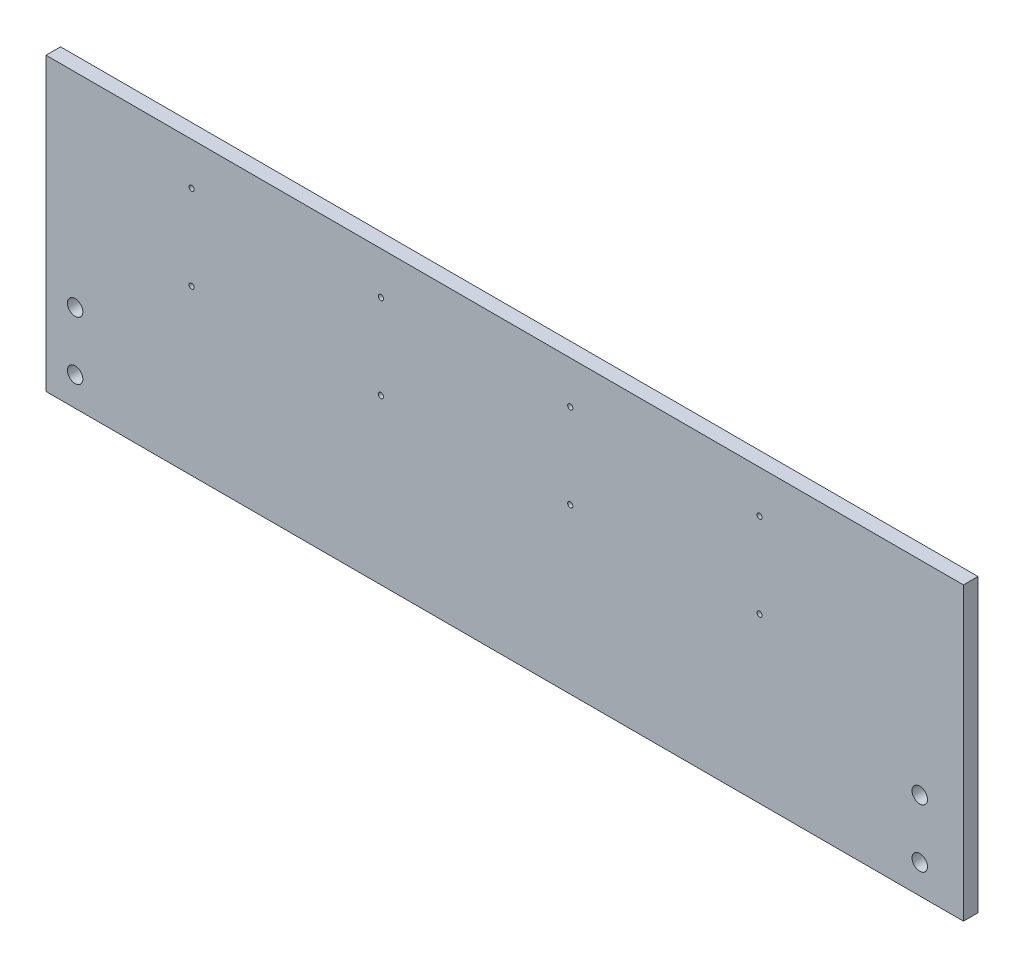
ISO-10303-21;
HEADER;
FILE_DESCRIPTION(('STEP AP214'),'2;1');
FILE_NAME('part.step','',(''),(''),'','','');
FILE_SCHEMA(('AUTOMOTIVE_DESIGN { 1 0 10303 214 1 1 1 1 }'));
ENDSEC;
DATA;
#1=APPLICATION_CONTEXT('core data for automotive mechanical design processes');
#2=APPLICATION_PROTOCOL_DEFINITION('international standard','automotive_design',2000,#1);
#3=PRODUCT_CONTEXT('',#1,'mechanical');
#4=PRODUCT('Part','Part','',(#3));
#5=PRODUCT_RELATED_PRODUCT_CATEGORY('part','',(#4));
#6=PRODUCT_DEFINITION_FORMATION('','',#4);
#7=PRODUCT_DEFINITION_CONTEXT('part definition',#1,'design');
#8=PRODUCT_DEFINITION('design','',#6,#7);
#9=PRODUCT_DEFINITION_SHAPE('','',#8);
#10=(LENGTH_UNIT() NAMED_UNIT(*) SI_UNIT(.MILLI.,.METRE.));
#11=(NAMED_UNIT(*) PLANE_ANGLE_UNIT() SI_UNIT($,.RADIAN.));
#12=(NAMED_UNIT(*) SI_UNIT($,.STERADIAN.) SOLID_ANGLE_UNIT());
#13=UNCERTAINTY_MEASURE_WITH_UNIT(LENGTH_MEASURE(1.E-05),#10,'distance_accuracy_value','');
#14=(GEOMETRIC_REPRESENTATION_CONTEXT(3) GLOBAL_UNCERTAINTY_ASSIGNED_CONTEXT((#13)) GLOBAL_UNIT_ASSIGNED_CONTEXT((#10,
#11,#12)) REPRESENTATION_CONTEXT('',''));
#15=CARTESIAN_POINT('',(0.,0.,0.));
#16=DIRECTION('',(0.,0.,1.));
#17=DIRECTION('',(1.,0.,0.));
#18=AXIS2_PLACEMENT_3D('',#15,#16,#17);
#19=CARTESIAN_POINT('',(0.,0.,0.));
#20=DIRECTION('',(0.,0.,-1.));
#21=DIRECTION('',(-1.,0.,0.));
#22=AXIS2_PLACEMENT_3D('',#19,#20,#21);
#23=PLANE('',#22);
#24=DIRECTION('',(0.,1.,0.));
#25=VECTOR('',#24,1.);
#26=CARTESIAN_POINT('',(200.025,-63.5,0.));
#27=LINE('',#26,#25);
#28=CARTESIAN_POINT('',(200.025,-63.5,0.));
#29=VERTEX_POINT('',#28);
#30=CARTESIAN_POINT('',(200.025,63.5,0.));
#31=VERTEX_POINT('',#30);
#32=EDGE_CURVE('E117',#29,#31,#27,.T.);
#33=ORIENTED_EDGE('',*,*,#32,.F.);
#34=DIRECTION('',(1.,0.,0.));
#35=VECTOR('',#34,1.);
#36=CARTESIAN_POINT('',(-200.025,-63.5,0.));
#37=LINE('',#36,#35);
#38=CARTESIAN_POINT('',(-200.025,-63.5,0.));
#39=VERTEX_POINT('',#38);
#40=EDGE_CURVE('E93',#39,#29,#37,.T.);
#41=ORIENTED_EDGE('',*,*,#40,.F.);
#42=DIRECTION('',(0.,-1.,0.));
#43=VECTOR('',#42,1.);
#44=CARTESIAN_POINT('',(-200.025,-63.5,0.));
#45=LINE('',#44,#43);
#46=CARTESIAN_POINT('',(-200.025,63.5,0.));
#47=VERTEX_POINT('',#46);
#48=EDGE_CURVE('E87',#47,#39,#45,.T.);
#49=ORIENTED_EDGE('',*,*,#48,.F.);
#50=DIRECTION('',(-1.,0.,0.));
#51=VECTOR('',#50,1.);
#52=CARTESIAN_POINT('',(-200.025,63.5,0.));
#53=LINE('',#52,#51);
#54=EDGE_CURVE('E109',#31,#47,#53,.T.);
#55=ORIENTED_EDGE('',*,*,#54,.F.);
#56=EDGE_LOOP('',(#33,#41,#49,#55));
#57=FACE_BOUND('',#56,.T.);
#58=CARTESIAN_POINT('',(180.975,-50.8,0.));
#59=DIRECTION('',(0.,0.,-1.));
#60=DIRECTION('',(-1.,0.,0.));
#61=AXIS2_PLACEMENT_3D('',#58,#59,#60);
#62=CIRCLE('',#61,3.36549999999999);
#63=CARTESIAN_POINT('',(177.6095,-50.8,0.));
#64=VERTEX_POINT('',#63);
#65=EDGE_CURVE('E131',#64,#64,#62,.T.);
#66=ORIENTED_EDGE('',*,*,#65,.F.);
#67=EDGE_LOOP('',(#66));
#68=FACE_BOUND('',#67,.T.);
#69=CARTESIAN_POINT('',(-187.325,-25.4,0.));
#70=DIRECTION('',(0.,0.,-1.));
#71=DIRECTION('',(-1.,0.,0.));
#72=AXIS2_PLACEMENT_3D('',#69,#70,#71);
#73=CIRCLE('',#72,3.36549999999999);
#74=CARTESIAN_POINT('',(-190.6905,-25.4,0.));
#75=VERTEX_POINT('',#74);
#76=EDGE_CURVE('E141',#75,#75,#73,.T.);
#77=ORIENTED_EDGE('',*,*,#76,.F.);
#78=EDGE_LOOP('',(#77));
#79=FACE_BOUND('',#78,.T.);
#80=CARTESIAN_POINT('',(-187.325,-50.8,0.));
#81=DIRECTION('',(0.,0.,-1.));
#82=DIRECTION('',(-1.,0.,0.));
#83=AXIS2_PLACEMENT_3D('',#80,#81,#82);
#84=CIRCLE('',#83,3.36549999999999);
#85=CARTESIAN_POINT('',(-190.6905,-50.8,0.));
#86=VERTEX_POINT('',#85);
#87=EDGE_CURVE('E140',#86,#86,#84,.T.);
#88=ORIENTED_EDGE('',*,*,#87,.F.);
#89=EDGE_LOOP('',(#88));
#90=FACE_BOUND('',#89,.T.);
#91=CARTESIAN_POINT('',(180.975,-25.4,0.));
#92=DIRECTION('',(0.,0.,-1.));
#93=DIRECTION('',(-1.,0.,0.));
#94=AXIS2_PLACEMENT_3D('',#91,#92,#93);
#95=CIRCLE('',#94,3.36549999999999);
#96=CARTESIAN_POINT('',(177.6095,-25.4,0.));
#97=VERTEX_POINT('',#96);
#98=EDGE_CURVE('E134',#97,#97,#95,.T.);
#99=ORIENTED_EDGE('',*,*,#98,.F.);
#100=EDGE_LOOP('',(#99));
#101=FACE_BOUND('',#100,.T.);
#102=CARTESIAN_POINT('',(111.125,8.02499999999928,0.));
#103=DIRECTION('',(0.,0.,1.));
#104=DIRECTION('',(1.,0.,0.));
#105=AXIS2_PLACEMENT_3D('',#102,#103,#104);
#106=CIRCLE('',#105,1.1303);
#107=CARTESIAN_POINT('',(112.2553,8.02499999999928,0.));
#108=VERTEX_POINT('',#107);
#109=EDGE_CURVE('E152',#108,#108,#106,.T.);
#110=ORIENTED_EDGE('',*,*,#109,.T.);
#111=EDGE_LOOP('',(#110));
#112=FACE_BOUND('',#111,.T.);
#113=CARTESIAN_POINT('',(111.125,45.0249999999993,0.));
#114=DIRECTION('',(0.,0.,1.));
#115=DIRECTION('',(1.,0.,0.));
#116=AXIS2_PLACEMENT_3D('',#113,#114,#115);
#117=CIRCLE('',#116,1.1303);
#118=CARTESIAN_POINT('',(112.2553,45.0249999999993,0.));
#119=VERTEX_POINT('',#118);
#120=EDGE_CURVE('E160',#119,#119,#117,.T.);
#121=ORIENTED_EDGE('',*,*,#120,.T.);
#122=EDGE_LOOP('',(#121));
#123=FACE_BOUND('',#122,.T.);
#124=CARTESIAN_POINT('',(28.575,8.02500000000007,0.));
#125=DIRECTION('',(0.,0.,1.));
#126=DIRECTION('',(1.,0.,0.));
#127=AXIS2_PLACEMENT_3D('',#124,#125,#126);
#128=CIRCLE('',#127,1.1303);
#129=CARTESIAN_POINT('',(29.7053,8.02500000000007,0.));
#130=VERTEX_POINT('',#129);
#131=EDGE_CURVE('E166',#130,#130,#128,.T.);
#132=ORIENTED_EDGE('',*,*,#131,.T.);
#133=EDGE_LOOP('',(#132));
#134=FACE_BOUND('',#133,.T.);
#135=CARTESIAN_POINT('',(28.575,45.0250000000001,0.));
#136=DIRECTION('',(0.,0.,1.));
#137=DIRECTION('',(1.,0.,0.));
#138=AXIS2_PLACEMENT_3D('',#135,#136,#137);
#139=CIRCLE('',#138,1.1303);
#140=CARTESIAN_POINT('',(29.7053,45.0250000000001,0.));
#141=VERTEX_POINT('',#140);
#142=EDGE_CURVE('E172',#141,#141,#139,.T.);
#143=ORIENTED_EDGE('',*,*,#142,.T.);
#144=EDGE_LOOP('',(#143));
#145=FACE_BOUND('',#144,.T.);
#146=CARTESIAN_POINT('',(-53.9749999999998,8.0250000000005,0.));
#147=DIRECTION('',(0.,0.,1.));
#148=DIRECTION('',(1.,0.,0.));
#149=AXIS2_PLACEMENT_3D('',#146,#147,#148);
#150=CIRCLE('',#149,1.1303);
#151=CARTESIAN_POINT('',(-52.8446999999998,8.0250000000005,0.));
#152=VERTEX_POINT('',#151);
#153=EDGE_CURVE('E178',#152,#152,#150,.T.);
#154=ORIENTED_EDGE('',*,*,#153,.T.);
#155=EDGE_LOOP('',(#154));
#156=FACE_BOUND('',#155,.T.);
#157=CARTESIAN_POINT('',(-53.9749999999998,45.0250000000005,0.));
#158=DIRECTION('',(0.,0.,1.));
#159=DIRECTION('',(1.,0.,0.));
#160=AXIS2_PLACEMENT_3D('',#157,#158,#159);
#161=CIRCLE('',#160,1.1303);
#162=CARTESIAN_POINT('',(-52.8446999999998,45.0250000000005,0.));
#163=VERTEX_POINT('',#162);
#164=EDGE_CURVE('E184',#163,#163,#161,.T.);
#165=ORIENTED_EDGE('',*,*,#164,.T.);
#166=EDGE_LOOP('',(#165));
#167=FACE_BOUND('',#166,.T.);
#168=CARTESIAN_POINT('',(-136.525,8.02500000000135,0.));
#169=DIRECTION('',(0.,0.,1.));
#170=DIRECTION('',(1.,0.,0.));
#171=AXIS2_PLACEMENT_3D('',#168,#169,#170);
#172=CIRCLE('',#171,1.1303);
#173=CARTESIAN_POINT('',(-135.3947,8.02500000000135,0.));
#174=VERTEX_POINT('',#173);
#175=EDGE_CURVE('E190',#174,#174,#172,.T.);
#176=ORIENTED_EDGE('',*,*,#175,.T.);
#177=EDGE_LOOP('',(#176));
#178=FACE_BOUND('',#177,.T.);
#179=CARTESIAN_POINT('',(-136.525,45.0250000000014,0.));
#180=DIRECTION('',(0.,0.,1.));
#181=DIRECTION('',(1.,0.,0.));
#182=AXIS2_PLACEMENT_3D('',#179,#180,#181);
#183=CIRCLE('',#182,1.1303);
#184=CARTESIAN_POINT('',(-135.3947,45.0250000000014,0.));
#185=VERTEX_POINT('',#184);
#186=EDGE_CURVE('E196',#185,#185,#183,.T.);
#187=ORIENTED_EDGE('',*,*,#186,.T.);
#188=EDGE_LOOP('',(#187));
#189=FACE_BOUND('',#188,.T.);
#190=ADVANCED_FACE('F53',(#57,#68,#79,#90,#101,#112,#123,#134,#145,#156,#167,#178,#189),#23,.T.);
#191=CARTESIAN_POINT('',(200.025,-63.5,6.35));
#192=DIRECTION('',(-1.,0.,0.));
#193=DIRECTION('',(0.,0.,1.));
#194=AXIS2_PLACEMENT_3D('',#191,#192,#193);
#195=PLANE('',#194);
#196=ORIENTED_EDGE('',*,*,#32,.T.);
#197=DIRECTION('',(0.,0.,-1.));
#198=VECTOR('',#197,1.);
#199=CARTESIAN_POINT('',(200.025,63.5,6.35));
#200=LINE('',#199,#198);
#201=CARTESIAN_POINT('',(200.025,63.5,6.35));
#202=VERTEX_POINT('',#201);
#203=EDGE_CURVE('E11',#202,#31,#200,.T.);
#204=ORIENTED_EDGE('',*,*,#203,.F.);
#205=DIRECTION('',(0.,1.,0.));
#206=VECTOR('',#205,1.);
#207=CARTESIAN_POINT('',(200.025,-63.5,6.35));
#208=LINE('',#207,#206);
#209=CARTESIAN_POINT('',(200.025,-63.5,6.35));
#210=VERTEX_POINT('',#209);
#211=EDGE_CURVE('E105',#210,#202,#208,.T.);
#212=ORIENTED_EDGE('',*,*,#211,.F.);
#213=DIRECTION('',(0.,0.,-1.));
#214=VECTOR('',#213,1.);
#215=CARTESIAN_POINT('',(200.025,-63.5,6.35));
#216=LINE('',#215,#214);
#217=EDGE_CURVE('E113',#210,#29,#216,.T.);
#218=ORIENTED_EDGE('',*,*,#217,.T.);
#219=EDGE_LOOP('',(#196,#204,#212,#218));
#220=FACE_BOUND('',#219,.T.);
#221=ADVANCED_FACE('F55',(#220),#195,.F.);
#222=CARTESIAN_POINT('',(-200.025,63.5,6.35));
#223=DIRECTION('',(0.,-1.,0.));
#224=DIRECTION('',(0.,0.,-1.));
#225=AXIS2_PLACEMENT_3D('',#222,#223,#224);
#226=PLANE('',#225);
#227=ORIENTED_EDGE('',*,*,#54,.T.);
#228=DIRECTION('',(0.,0.,-1.));
#229=VECTOR('',#228,1.);
#230=CARTESIAN_POINT('',(-200.025,63.5,6.35));
#231=LINE('',#230,#229);
#232=CARTESIAN_POINT('',(-200.025,63.5,6.35));
#233=VERTEX_POINT('',#232);
#234=EDGE_CURVE('E62',#233,#47,#231,.T.);
#235=ORIENTED_EDGE('',*,*,#234,.F.);
#236=DIRECTION('',(-1.,0.,0.));
#237=VECTOR('',#236,1.);
#238=CARTESIAN_POINT('',(-200.025,63.5,6.35));
#239=LINE('',#238,#237);
#240=EDGE_CURVE('E100',#202,#233,#239,.T.);
#241=ORIENTED_EDGE('',*,*,#240,.F.);
#242=ORIENTED_EDGE('',*,*,#203,.T.);
#243=EDGE_LOOP('',(#227,#235,#241,#242));
#244=FACE_BOUND('',#243,.T.);
#245=ADVANCED_FACE('F108',(#244),#226,.F.);
#246=CARTESIAN_POINT('',(-200.025,-63.5,6.35));
#247=DIRECTION('',(1.,0.,0.));
#248=DIRECTION('',(0.,0.,-1.));
#249=AXIS2_PLACEMENT_3D('',#246,#247,#248);
#250=PLANE('',#249);
#251=ORIENTED_EDGE('',*,*,#48,.T.);
#252=DIRECTION('',(0.,0.,-1.));
#253=VECTOR('',#252,1.);
#254=CARTESIAN_POINT('',(-200.025,-63.5,6.35));
#255=LINE('',#254,#253);
#256=CARTESIAN_POINT('',(-200.025,-63.5,6.35));
#257=VERTEX_POINT('',#256);
#258=EDGE_CURVE('E110',#257,#39,#255,.T.);
#259=ORIENTED_EDGE('',*,*,#258,.F.);
#260=DIRECTION('',(0.,-1.,0.));
#261=VECTOR('',#260,1.);
#262=CARTESIAN_POINT('',(-200.025,-63.5,6.35));
#263=LINE('',#262,#261);
#264=EDGE_CURVE('E103',#233,#257,#263,.T.);
#265=ORIENTED_EDGE('',*,*,#264,.F.);
#266=ORIENTED_EDGE('',*,*,#234,.T.);
#267=EDGE_LOOP('',(#251,#259,#265,#266));
#268=FACE_BOUND('',#267,.T.);
#269=ADVANCED_FACE('F111',(#268),#250,.F.);
#270=CARTESIAN_POINT('',(-200.025,-63.5,6.35));
#271=DIRECTION('',(0.,1.,0.));
#272=DIRECTION('',(0.,0.,1.));
#273=AXIS2_PLACEMENT_3D('',#270,#271,#272);
#274=PLANE('',#273);
#275=ORIENTED_EDGE('',*,*,#40,.T.);
#276=ORIENTED_EDGE('',*,*,#217,.F.);
#277=DIRECTION('',(1.,0.,0.));
#278=VECTOR('',#277,1.);
#279=CARTESIAN_POINT('',(-200.025,-63.5,6.35));
#280=LINE('',#279,#278);
#281=EDGE_CURVE('E70',#257,#210,#280,.T.);
#282=ORIENTED_EDGE('',*,*,#281,.F.);
#283=ORIENTED_EDGE('',*,*,#258,.T.);
#284=EDGE_LOOP('',(#275,#276,#282,#283));
#285=FACE_BOUND('',#284,.T.);
#286=ADVANCED_FACE('F125',(#285),#274,.F.);
#287=CARTESIAN_POINT('',(0.,0.,6.35));
#288=DIRECTION('',(0.,0.,-1.));
#289=DIRECTION('',(-1.,0.,0.));
#290=AXIS2_PLACEMENT_3D('',#287,#288,#289);
#291=PLANE('',#290);
#292=CARTESIAN_POINT('',(-136.525,45.0250000000014,6.35));
#293=DIRECTION('',(0.,0.,1.));
#294=DIRECTION('',(1.,0.,0.));
#295=AXIS2_PLACEMENT_3D('',#292,#293,#294);
#296=CIRCLE('',#295,1.1303);
#297=CARTESIAN_POINT('',(-135.3947,45.0250000000014,6.35));
#298=VERTEX_POINT('',#297);
#299=EDGE_CURVE('E199',#298,#298,#296,.T.);
#300=ORIENTED_EDGE('',*,*,#299,.F.);
#301=EDGE_LOOP('',(#300));
#302=FACE_BOUND('',#301,.T.);
#303=CARTESIAN_POINT('',(-136.525,8.02500000000135,6.35));
#304=DIRECTION('',(0.,0.,1.));
#305=DIRECTION('',(1.,0.,0.));
#306=AXIS2_PLACEMENT_3D('',#303,#304,#305);
#307=CIRCLE('',#306,1.1303);
#308=CARTESIAN_POINT('',(-135.3947,8.02500000000135,6.35));
#309=VERTEX_POINT('',#308);
#310=EDGE_CURVE('E193',#309,#309,#307,.T.);
#311=ORIENTED_EDGE('',*,*,#310,.F.);
#312=EDGE_LOOP('',(#311));
#313=FACE_BOUND('',#312,.T.);
#314=CARTESIAN_POINT('',(-53.9749999999998,45.0250000000005,6.35));
#315=DIRECTION('',(0.,0.,1.));
#316=DIRECTION('',(1.,0.,0.));
#317=AXIS2_PLACEMENT_3D('',#314,#315,#316);
#318=CIRCLE('',#317,1.1303);
#319=CARTESIAN_POINT('',(-52.8446999999998,45.0250000000005,6.35));
#320=VERTEX_POINT('',#319);
#321=EDGE_CURVE('E187',#320,#320,#318,.T.);
#322=ORIENTED_EDGE('',*,*,#321,.F.);
#323=EDGE_LOOP('',(#322));
#324=FACE_BOUND('',#323,.T.);
#325=CARTESIAN_POINT('',(-53.9749999999998,8.0250000000005,6.35));
#326=DIRECTION('',(0.,0.,1.));
#327=DIRECTION('',(1.,0.,0.));
#328=AXIS2_PLACEMENT_3D('',#325,#326,#327);
#329=CIRCLE('',#328,1.1303);
#330=CARTESIAN_POINT('',(-52.8446999999998,8.0250000000005,6.35));
#331=VERTEX_POINT('',#330);
#332=EDGE_CURVE('E181',#331,#331,#329,.T.);
#333=ORIENTED_EDGE('',*,*,#332,.F.);
#334=EDGE_LOOP('',(#333));
#335=FACE_BOUND('',#334,.T.);
#336=CARTESIAN_POINT('',(28.575,45.0250000000001,6.35));
#337=DIRECTION('',(0.,0.,1.));
#338=DIRECTION('',(1.,0.,0.));
#339=AXIS2_PLACEMENT_3D('',#336,#337,#338);
#340=CIRCLE('',#339,1.1303);
#341=CARTESIAN_POINT('',(29.7053,45.0250000000001,6.35));
#342=VERTEX_POINT('',#341);
#343=EDGE_CURVE('E175',#342,#342,#340,.T.);
#344=ORIENTED_EDGE('',*,*,#343,.F.);
#345=EDGE_LOOP('',(#344));
#346=FACE_BOUND('',#345,.T.);
#347=CARTESIAN_POINT('',(28.575,8.02500000000007,6.35));
#348=DIRECTION('',(0.,0.,1.));
#349=DIRECTION('',(1.,0.,0.));
#350=AXIS2_PLACEMENT_3D('',#347,#348,#349);
#351=CIRCLE('',#350,1.1303);
#352=CARTESIAN_POINT('',(29.7053,8.02500000000007,6.35));
#353=VERTEX_POINT('',#352);
#354=EDGE_CURVE('E169',#353,#353,#351,.T.);
#355=ORIENTED_EDGE('',*,*,#354,.F.);
#356=EDGE_LOOP('',(#355));
#357=FACE_BOUND('',#356,.T.);
#358=CARTESIAN_POINT('',(111.125,45.0249999999993,6.35));
#359=DIRECTION('',(0.,0.,1.));
#360=DIRECTION('',(1.,0.,0.));
#361=AXIS2_PLACEMENT_3D('',#358,#359,#360);
#362=CIRCLE('',#361,1.1303);
#363=CARTESIAN_POINT('',(112.2553,45.0249999999993,6.35));
#364=VERTEX_POINT('',#363);
#365=EDGE_CURVE('E163',#364,#364,#362,.T.);
#366=ORIENTED_EDGE('',*,*,#365,.F.);
#367=EDGE_LOOP('',(#366));
#368=FACE_BOUND('',#367,.T.);
#369=CARTESIAN_POINT('',(111.125,8.02499999999928,6.35));
#370=DIRECTION('',(0.,0.,1.));
#371=DIRECTION('',(1.,0.,0.));
#372=AXIS2_PLACEMENT_3D('',#369,#370,#371);
#373=CIRCLE('',#372,1.1303);
#374=CARTESIAN_POINT('',(112.2553,8.02499999999928,6.35));
#375=VERTEX_POINT('',#374);
#376=EDGE_CURVE('E157',#375,#375,#373,.T.);
#377=ORIENTED_EDGE('',*,*,#376,.F.);
#378=EDGE_LOOP('',(#377));
#379=FACE_BOUND('',#378,.T.);
#380=CARTESIAN_POINT('',(180.975,-25.4,6.35));
#381=DIRECTION('',(0.,0.,-1.));
#382=DIRECTION('',(-1.,0.,0.));
#383=AXIS2_PLACEMENT_3D('',#380,#381,#382);
#384=CIRCLE('',#383,3.36549999999999);
#385=CARTESIAN_POINT('',(177.6095,-25.4,6.35));
#386=VERTEX_POINT('',#385);
#387=EDGE_CURVE('E144',#386,#386,#384,.T.);
#388=ORIENTED_EDGE('',*,*,#387,.T.);
#389=EDGE_LOOP('',(#388));
#390=FACE_BOUND('',#389,.T.);
#391=CARTESIAN_POINT('',(-187.325,-50.8,6.35));
#392=DIRECTION('',(0.,0.,-1.));
#393=DIRECTION('',(-1.,0.,0.));
#394=AXIS2_PLACEMENT_3D('',#391,#392,#393);
#395=CIRCLE('',#394,3.36549999999999);
#396=CARTESIAN_POINT('',(-190.6905,-50.8,6.35));
#397=VERTEX_POINT('',#396);
#398=EDGE_CURVE('E137',#397,#397,#395,.T.);
#399=ORIENTED_EDGE('',*,*,#398,.T.);
#400=EDGE_LOOP('',(#399));
#401=FACE_BOUND('',#400,.T.);
#402=CARTESIAN_POINT('',(-187.325,-25.4,6.35));
#403=DIRECTION('',(0.,0.,-1.));
#404=DIRECTION('',(-1.,0.,0.));
#405=AXIS2_PLACEMENT_3D('',#402,#403,#404);
#406=CIRCLE('',#405,3.36549999999999);
#407=CARTESIAN_POINT('',(-190.6905,-25.4,6.35));
#408=VERTEX_POINT('',#407);
#409=EDGE_CURVE('E149',#408,#408,#406,.T.);
#410=ORIENTED_EDGE('',*,*,#409,.T.);
#411=EDGE_LOOP('',(#410));
#412=FACE_BOUND('',#411,.T.);
#413=CARTESIAN_POINT('',(180.975,-50.8,6.35));
#414=DIRECTION('',(0.,0.,-1.));
#415=DIRECTION('',(-1.,0.,0.));
#416=AXIS2_PLACEMENT_3D('',#413,#414,#415);
#417=CIRCLE('',#416,3.36549999999999);
#418=CARTESIAN_POINT('',(177.6095,-50.8,6.35));
#419=VERTEX_POINT('',#418);
#420=EDGE_CURVE('E120',#419,#419,#417,.T.);
#421=ORIENTED_EDGE('',*,*,#420,.T.);
#422=EDGE_LOOP('',(#421));
#423=FACE_BOUND('',#422,.T.);
#424=ORIENTED_EDGE('',*,*,#211,.T.);
#425=ORIENTED_EDGE('',*,*,#240,.T.);
#426=ORIENTED_EDGE('',*,*,#264,.T.);
#427=ORIENTED_EDGE('',*,*,#281,.T.);
#428=EDGE_LOOP('',(#424,#425,#426,#427));
#429=FACE_BOUND('',#428,.T.);
#430=ADVANCED_FACE('F101',(#302,#313,#324,#335,#346,#357,#368,#379,#390,#401,#412,#423,#429),
#291,.F.);
#431=CARTESIAN_POINT('',(180.975,-50.8,6.35));
#432=DIRECTION('',(0.,0.,-1.));
#433=DIRECTION('',(-1.,0.,0.));
#434=AXIS2_PLACEMENT_3D('',#431,#432,#433);
#435=CYLINDRICAL_SURFACE('',#434,3.36549999999999);
#436=ORIENTED_EDGE('',*,*,#420,.F.);
#437=EDGE_LOOP('',(#436));
#438=FACE_BOUND('',#437,.T.);
#439=ORIENTED_EDGE('',*,*,#65,.T.);
#440=EDGE_LOOP('',(#439));
#441=FACE_BOUND('',#440,.T.);
#442=ADVANCED_FACE('F207',(#438,#441),#435,.F.);
#443=CARTESIAN_POINT('',(-187.325,-25.4,6.35));
#444=DIRECTION('',(0.,0.,-1.));
#445=DIRECTION('',(-1.,0.,0.));
#446=AXIS2_PLACEMENT_3D('',#443,#444,#445);
#447=CYLINDRICAL_SURFACE('',#446,3.36549999999999);
#448=ORIENTED_EDGE('',*,*,#409,.F.);
#449=EDGE_LOOP('',(#448));
#450=FACE_BOUND('',#449,.T.);
#451=ORIENTED_EDGE('',*,*,#76,.T.);
#452=EDGE_LOOP('',(#451));
#453=FACE_BOUND('',#452,.T.);
#454=ADVANCED_FACE('F233',(#450,#453),#447,.F.);
#455=CARTESIAN_POINT('',(-187.325,-50.8,6.35));
#456=DIRECTION('',(0.,0.,-1.));
#457=DIRECTION('',(-1.,0.,0.));
#458=AXIS2_PLACEMENT_3D('',#455,#456,#457);
#459=CYLINDRICAL_SURFACE('',#458,3.36549999999999);
#460=ORIENTED_EDGE('',*,*,#398,.F.);
#461=EDGE_LOOP('',(#460));
#462=FACE_BOUND('',#461,.T.);
#463=ORIENTED_EDGE('',*,*,#87,.T.);
#464=EDGE_LOOP('',(#463));
#465=FACE_BOUND('',#464,.T.);
#466=ADVANCED_FACE('F298',(#462,#465),#459,.F.);
#467=CARTESIAN_POINT('',(180.975,-25.4,6.35));
#468=DIRECTION('',(0.,0.,-1.));
#469=DIRECTION('',(-1.,0.,0.));
#470=AXIS2_PLACEMENT_3D('',#467,#468,#469);
#471=CYLINDRICAL_SURFACE('',#470,3.36549999999999);
#472=ORIENTED_EDGE('',*,*,#387,.F.);
#473=EDGE_LOOP('',(#472));
#474=FACE_BOUND('',#473,.T.);
#475=ORIENTED_EDGE('',*,*,#98,.T.);
#476=EDGE_LOOP('',(#475));
#477=FACE_BOUND('',#476,.T.);
#478=ADVANCED_FACE('F294',(#474,#477),#471,.F.);
#479=CARTESIAN_POINT('',(111.125,8.02499999999928,6.35));
#480=DIRECTION('',(0.,0.,1.));
#481=DIRECTION('',(1.,0.,0.));
#482=AXIS2_PLACEMENT_3D('',#479,#480,#481);
#483=CYLINDRICAL_SURFACE('',#482,1.1303);
#484=ORIENTED_EDGE('',*,*,#109,.F.);
#485=EDGE_LOOP('',(#484));
#486=FACE_BOUND('',#485,.T.);
#487=ORIENTED_EDGE('',*,*,#376,.T.);
#488=EDGE_LOOP('',(#487));
#489=FACE_BOUND('',#488,.T.);
#490=ADVANCED_FACE('F290',(#486,#489),#483,.F.);
#491=CARTESIAN_POINT('',(111.125,45.0249999999993,6.35));
#492=DIRECTION('',(0.,0.,1.));
#493=DIRECTION('',(1.,0.,0.));
#494=AXIS2_PLACEMENT_3D('',#491,#492,#493);
#495=CYLINDRICAL_SURFACE('',#494,1.1303);
#496=ORIENTED_EDGE('',*,*,#120,.F.);
#497=EDGE_LOOP('',(#496));
#498=FACE_BOUND('',#497,.T.);
#499=ORIENTED_EDGE('',*,*,#365,.T.);
#500=EDGE_LOOP('',(#499));
#501=FACE_BOUND('',#500,.T.);
#502=ADVANCED_FACE('F286',(#498,#501),#495,.F.);
#503=CARTESIAN_POINT('',(28.575,8.02500000000007,6.35));
#504=DIRECTION('',(0.,0.,1.));
#505=DIRECTION('',(1.,0.,0.));
#506=AXIS2_PLACEMENT_3D('',#503,#504,#505);
#507=CYLINDRICAL_SURFACE('',#506,1.1303);
#508=ORIENTED_EDGE('',*,*,#131,.F.);
#509=EDGE_LOOP('',(#508));
#510=FACE_BOUND('',#509,.T.);
#511=ORIENTED_EDGE('',*,*,#354,.T.);
#512=EDGE_LOOP('',(#511));
#513=FACE_BOUND('',#512,.T.);
#514=ADVANCED_FACE('F282',(#510,#513),#507,.F.);
#515=CARTESIAN_POINT('',(28.575,45.0250000000001,6.35));
#516=DIRECTION('',(0.,0.,1.));
#517=DIRECTION('',(1.,0.,0.));
#518=AXIS2_PLACEMENT_3D('',#515,#516,#517);
#519=CYLINDRICAL_SURFACE('',#518,1.1303);
#520=ORIENTED_EDGE('',*,*,#142,.F.);
#521=EDGE_LOOP('',(#520));
#522=FACE_BOUND('',#521,.T.);
#523=ORIENTED_EDGE('',*,*,#343,.T.);
#524=EDGE_LOOP('',(#523));
#525=FACE_BOUND('',#524,.T.);
#526=ADVANCED_FACE('F278',(#522,#525),#519,.F.);
#527=CARTESIAN_POINT('',(-53.9749999999998,8.0250000000005,6.35));
#528=DIRECTION('',(0.,0.,1.));
#529=DIRECTION('',(1.,0.,0.));
#530=AXIS2_PLACEMENT_3D('',#527,#528,#529);
#531=CYLINDRICAL_SURFACE('',#530,1.1303);
#532=ORIENTED_EDGE('',*,*,#153,.F.);
#533=EDGE_LOOP('',(#532));
#534=FACE_BOUND('',#533,.T.);
#535=ORIENTED_EDGE('',*,*,#332,.T.);
#536=EDGE_LOOP('',(#535));
#537=FACE_BOUND('',#536,.T.);
#538=ADVANCED_FACE('F274',(#534,#537),#531,.F.);
#539=CARTESIAN_POINT('',(-53.9749999999998,45.0250000000005,6.35));
#540=DIRECTION('',(0.,0.,1.));
#541=DIRECTION('',(1.,0.,0.));
#542=AXIS2_PLACEMENT_3D('',#539,#540,#541);
#543=CYLINDRICAL_SURFACE('',#542,1.1303);
#544=ORIENTED_EDGE('',*,*,#164,.F.);
#545=EDGE_LOOP('',(#544));
#546=FACE_BOUND('',#545,.T.);
#547=ORIENTED_EDGE('',*,*,#321,.T.);
#548=EDGE_LOOP('',(#547));
#549=FACE_BOUND('',#548,.T.);
#550=ADVANCED_FACE('F268',(#546,#549),#543,.F.);
#551=CARTESIAN_POINT('',(-136.525,8.02500000000135,6.35));
#552=DIRECTION('',(0.,0.,1.));
#553=DIRECTION('',(1.,0.,0.));
#554=AXIS2_PLACEMENT_3D('',#551,#552,#553);
#555=CYLINDRICAL_SURFACE('',#554,1.1303);
#556=ORIENTED_EDGE('',*,*,#175,.F.);
#557=EDGE_LOOP('',(#556));
#558=FACE_BOUND('',#557,.T.);
#559=ORIENTED_EDGE('',*,*,#310,.T.);
#560=EDGE_LOOP('',(#559));
#561=FACE_BOUND('',#560,.T.);
#562=ADVANCED_FACE('F262',(#558,#561),#555,.F.);
#563=CARTESIAN_POINT('',(-136.525,45.0250000000014,6.35));
#564=DIRECTION('',(0.,0.,1.));
#565=DIRECTION('',(1.,0.,0.));
#566=AXIS2_PLACEMENT_3D('',#563,#564,#565);
#567=CYLINDRICAL_SURFACE('',#566,1.1303);
#568=ORIENTED_EDGE('',*,*,#186,.F.);
#569=EDGE_LOOP('',(#568));
#570=FACE_BOUND('',#569,.T.);
#571=ORIENTED_EDGE('',*,*,#299,.T.);
#572=EDGE_LOOP('',(#571));
#573=FACE_BOUND('',#572,.T.);
#574=ADVANCED_FACE('F203',(#570,#573),#567,.F.);
#575=CLOSED_SHELL('',(#190,#221,#245,#269,#286,#430,#442,#454,#466,#478,#490,#502,#514,#526,
#538,#550,#562,#574));
#576=MANIFOLD_SOLID_BREP('B2',#575);
#577=ADVANCED_BREP_SHAPE_REPRESENTATION('',(#18,#576),#14);
#578=SHAPE_DEFINITION_REPRESENTATION(#9,#577);
ENDSEC;
END-ISO-10303-21;
